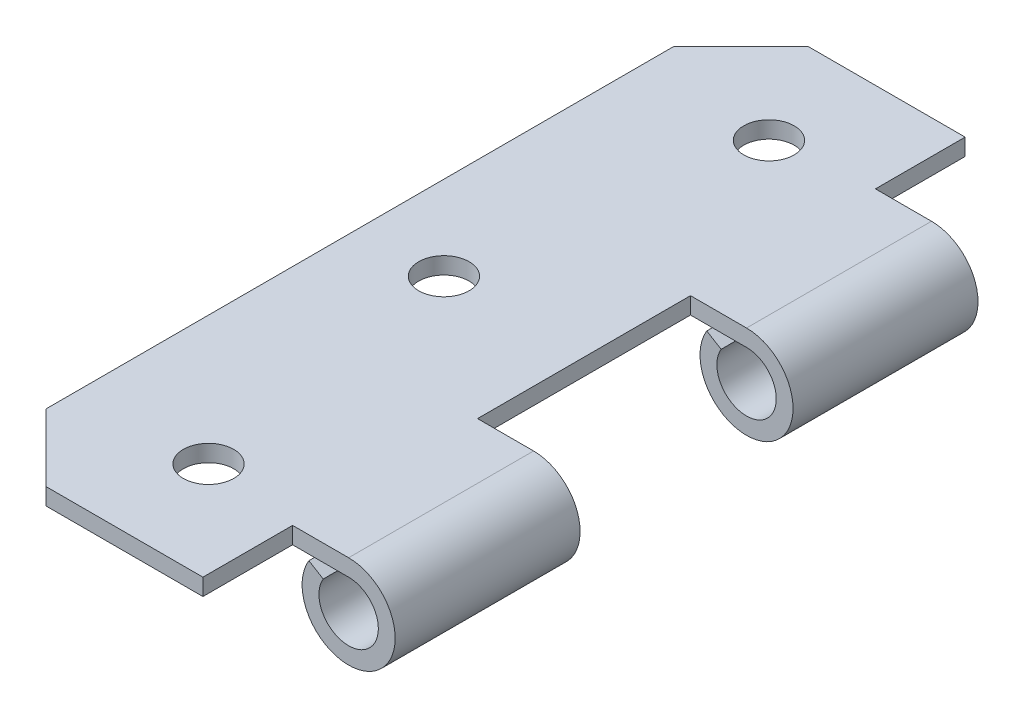
ISO-10303-21;
HEADER;
FILE_DESCRIPTION(('STEP AP214'),'2;1');
FILE_NAME('part.step','',(''),(''),'','','');
FILE_SCHEMA(('AUTOMOTIVE_DESIGN { 1 0 10303 214 1 1 1 1 }'));
ENDSEC;
DATA;
#1=APPLICATION_CONTEXT('core data for automotive mechanical design processes');
#2=APPLICATION_PROTOCOL_DEFINITION('international standard','automotive_design',2000,#1);
#3=PRODUCT_CONTEXT('',#1,'mechanical');
#4=PRODUCT('Part','Part','',(#3));
#5=PRODUCT_RELATED_PRODUCT_CATEGORY('part','',(#4));
#6=PRODUCT_DEFINITION_FORMATION('','',#4);
#7=PRODUCT_DEFINITION_CONTEXT('part definition',#1,'design');
#8=PRODUCT_DEFINITION('design','',#6,#7);
#9=PRODUCT_DEFINITION_SHAPE('','',#8);
#10=(LENGTH_UNIT() NAMED_UNIT(*) SI_UNIT(.MILLI.,.METRE.));
#11=(NAMED_UNIT(*) PLANE_ANGLE_UNIT() SI_UNIT($,.RADIAN.));
#12=(NAMED_UNIT(*) SI_UNIT($,.STERADIAN.) SOLID_ANGLE_UNIT());
#13=UNCERTAINTY_MEASURE_WITH_UNIT(LENGTH_MEASURE(1.E-05),#10,'distance_accuracy_value','');
#14=(GEOMETRIC_REPRESENTATION_CONTEXT(3) GLOBAL_UNCERTAINTY_ASSIGNED_CONTEXT((#13)) GLOBAL_UNIT_ASSIGNED_CONTEXT((#10,
#11,#12)) REPRESENTATION_CONTEXT('',''));
#15=CARTESIAN_POINT('',(0.,0.,0.));
#16=DIRECTION('',(0.,0.,1.));
#17=DIRECTION('',(1.,0.,0.));
#18=AXIS2_PLACEMENT_3D('',#15,#16,#17);
#19=CARTESIAN_POINT('',(12.5,-4.15,34.));
#20=DIRECTION('',(0.,0.,-1.));
#21=DIRECTION('',(-1.,0.,0.));
#22=AXIS2_PLACEMENT_3D('',#19,#20,#21);
#23=CYLINDRICAL_SURFACE('',#22,2.65);
#24=DIRECTION('',(0.,0.,-1.));
#25=VECTOR('',#24,1.);
#26=CARTESIAN_POINT('',(10.2333573843064,-2.77710843373494,34.));
#27=LINE('',#26,#25);
#28=CARTESIAN_POINT('',(10.2333573843064,-2.77710843373494,-9.5));
#29=VERTEX_POINT('',#28);
#30=CARTESIAN_POINT('',(10.2333573843064,-2.77710843373494,-26.));
#31=VERTEX_POINT('',#30);
#32=EDGE_CURVE('E281',#29,#31,#27,.T.);
#33=ORIENTED_EDGE('',*,*,#32,.F.);
#34=CARTESIAN_POINT('',(12.5,-4.15,-9.5));
#35=DIRECTION('',(0.,0.,-1.));
#36=DIRECTION('',(-1.,0.,0.));
#37=AXIS2_PLACEMENT_3D('',#34,#35,#36);
#38=CIRCLE('',#37,2.65);
#39=CARTESIAN_POINT('',(12.5,-1.5,-9.5));
#40=VERTEX_POINT('',#39);
#41=EDGE_CURVE('E227',#29,#40,#38,.F.);
#42=ORIENTED_EDGE('',*,*,#41,.T.);
#43=DIRECTION('',(0.,0.,-1.));
#44=VECTOR('',#43,1.);
#45=CARTESIAN_POINT('',(12.5,-1.5,34.));
#46=LINE('',#45,#44);
#47=CARTESIAN_POINT('',(12.5,-1.5,-26.));
#48=VERTEX_POINT('',#47);
#49=EDGE_CURVE('E266',#40,#48,#46,.T.);
#50=ORIENTED_EDGE('',*,*,#49,.T.);
#51=CARTESIAN_POINT('',(12.5,-4.15,-26.));
#52=DIRECTION('',(0.,0.,1.));
#53=DIRECTION('',(1.,0.,0.));
#54=AXIS2_PLACEMENT_3D('',#51,#52,#53);
#55=CIRCLE('',#54,2.65);
#56=EDGE_CURVE('E252',#48,#31,#55,.F.);
#57=ORIENTED_EDGE('',*,*,#56,.T.);
#58=EDGE_LOOP('',(#33,#42,#50,#57));
#59=FACE_BOUND('',#58,.T.);
#60=ADVANCED_FACE('F53',(#59),#23,.F.);
#61=CARTESIAN_POINT('',(8.95035213014023,-2.,34.));
#62=DIRECTION('',(0.518072289156626,0.855336836110788,0.));
#63=DIRECTION('',(-0.855336836110788,0.518072289156627,0.));
#64=AXIS2_PLACEMENT_3D('',#61,#62,#63);
#65=PLANE('',#64);
#66=DIRECTION('',(-0.855336836110788,0.518072289156627,0.));
#67=VECTOR('',#66,1.);
#68=CARTESIAN_POINT('',(8.95035213014023,-2.,-9.5));
#69=LINE('',#68,#67);
#70=CARTESIAN_POINT('',(8.95035213014023,-2.,-9.5));
#71=VERTEX_POINT('',#70);
#72=EDGE_CURVE('E230',#29,#71,#69,.T.);
#73=ORIENTED_EDGE('',*,*,#72,.F.);
#74=ORIENTED_EDGE('',*,*,#32,.T.);
#75=DIRECTION('',(0.855336836110788,-0.518072289156627,0.));
#76=VECTOR('',#75,1.);
#77=CARTESIAN_POINT('',(8.95035213014023,-2.,-26.));
#78=LINE('',#77,#76);
#79=CARTESIAN_POINT('',(8.95035213014023,-2.,-26.));
#80=VERTEX_POINT('',#79);
#81=EDGE_CURVE('E255',#80,#31,#78,.T.);
#82=ORIENTED_EDGE('',*,*,#81,.F.);
#83=DIRECTION('',(0.,0.,-1.));
#84=VECTOR('',#83,1.);
#85=CARTESIAN_POINT('',(8.95035213014023,-2.,34.));
#86=LINE('',#85,#84);
#87=EDGE_CURVE('E278',#71,#80,#86,.T.);
#88=ORIENTED_EDGE('',*,*,#87,.F.);
#89=EDGE_LOOP('',(#73,#74,#82,#88));
#90=FACE_BOUND('',#89,.T.);
#91=ADVANCED_FACE('F381',(#90),#65,.T.);
#92=CARTESIAN_POINT('',(12.5,-4.15,34.));
#93=DIRECTION('',(0.,0.,-1.));
#94=DIRECTION('',(-1.,0.,0.));
#95=AXIS2_PLACEMENT_3D('',#92,#93,#94);
#96=CYLINDRICAL_SURFACE('',#95,4.15);
#97=CARTESIAN_POINT('',(12.5,-4.15,-9.5));
#98=DIRECTION('',(0.,0.,-1.));
#99=DIRECTION('',(-1.,0.,0.));
#100=AXIS2_PLACEMENT_3D('',#97,#98,#99);
#101=CIRCLE('',#100,4.15);
#102=CARTESIAN_POINT('',(12.5,0.,-9.5));
#103=VERTEX_POINT('',#102);
#104=EDGE_CURVE('E233',#71,#103,#101,.F.);
#105=ORIENTED_EDGE('',*,*,#104,.F.);
#106=ORIENTED_EDGE('',*,*,#87,.T.);
#107=CARTESIAN_POINT('',(12.5,-4.15,-26.));
#108=DIRECTION('',(0.,0.,1.));
#109=DIRECTION('',(1.,0.,0.));
#110=AXIS2_PLACEMENT_3D('',#107,#108,#109);
#111=CIRCLE('',#110,4.15);
#112=CARTESIAN_POINT('',(12.5,0.,-26.));
#113=VERTEX_POINT('',#112);
#114=EDGE_CURVE('E258',#113,#80,#111,.F.);
#115=ORIENTED_EDGE('',*,*,#114,.F.);
#116=DIRECTION('',(0.,0.,-1.));
#117=VECTOR('',#116,1.);
#118=CARTESIAN_POINT('',(12.5,0.,34.));
#119=LINE('',#118,#117);
#120=EDGE_CURVE('E275',#103,#113,#119,.T.);
#121=ORIENTED_EDGE('',*,*,#120,.F.);
#122=EDGE_LOOP('',(#105,#106,#115,#121));
#123=FACE_BOUND('',#122,.T.);
#124=ADVANCED_FACE('F373',(#123),#96,.T.);
#125=CARTESIAN_POINT('',(10.2333573843064,-2.77710843373494,26.));
#126=VERTEX_POINT('',#125);
#127=CARTESIAN_POINT('',(10.2333573843064,-2.77710843373494,9.5));
#128=VERTEX_POINT('',#127);
#129=EDGE_CURVE('E283',#126,#128,#27,.T.);
#130=ORIENTED_EDGE('',*,*,#129,.F.);
#131=CARTESIAN_POINT('',(12.5,-4.15,26.));
#132=DIRECTION('',(0.,0.,-1.));
#133=DIRECTION('',(-1.,0.,0.));
#134=AXIS2_PLACEMENT_3D('',#131,#132,#133);
#135=CIRCLE('',#134,2.65);
#136=CARTESIAN_POINT('',(12.5,-1.5,26.));
#137=VERTEX_POINT('',#136);
#138=EDGE_CURVE('E235',#126,#137,#135,.F.);
#139=ORIENTED_EDGE('',*,*,#138,.T.);
#140=CARTESIAN_POINT('',(12.5,-1.5,9.5));
#141=VERTEX_POINT('',#140);
#142=EDGE_CURVE('E270',#137,#141,#46,.T.);
#143=ORIENTED_EDGE('',*,*,#142,.T.);
#144=CARTESIAN_POINT('',(12.5,-4.15,9.5));
#145=DIRECTION('',(0.,0.,1.));
#146=DIRECTION('',(1.,0.,0.));
#147=AXIS2_PLACEMENT_3D('',#144,#145,#146);
#148=CIRCLE('',#147,2.65);
#149=EDGE_CURVE('E220',#141,#128,#148,.F.);
#150=ORIENTED_EDGE('',*,*,#149,.T.);
#151=EDGE_LOOP('',(#130,#139,#143,#150));
#152=FACE_BOUND('',#151,.T.);
#153=ADVANCED_FACE('F348',(#152),#23,.F.);
#154=DIRECTION('',(-0.855336836110788,0.518072289156627,0.));
#155=VECTOR('',#154,1.);
#156=CARTESIAN_POINT('',(8.95035213014023,-2.,26.));
#157=LINE('',#156,#155);
#158=CARTESIAN_POINT('',(8.95035213014023,-2.,26.));
#159=VERTEX_POINT('',#158);
#160=EDGE_CURVE('E238',#126,#159,#157,.T.);
#161=ORIENTED_EDGE('',*,*,#160,.F.);
#162=ORIENTED_EDGE('',*,*,#129,.T.);
#163=DIRECTION('',(0.855336836110788,-0.518072289156627,0.));
#164=VECTOR('',#163,1.);
#165=CARTESIAN_POINT('',(8.95035213014023,-2.,9.5));
#166=LINE('',#165,#164);
#167=CARTESIAN_POINT('',(8.95035213014023,-2.,9.5));
#168=VERTEX_POINT('',#167);
#169=EDGE_CURVE('E223',#168,#128,#166,.T.);
#170=ORIENTED_EDGE('',*,*,#169,.F.);
#171=EDGE_CURVE('E280',#159,#168,#86,.T.);
#172=ORIENTED_EDGE('',*,*,#171,.F.);
#173=EDGE_LOOP('',(#161,#162,#170,#172));
#174=FACE_BOUND('',#173,.T.);
#175=ADVANCED_FACE('F352',(#174),#65,.T.);
#176=CARTESIAN_POINT('',(12.5,-4.15,26.));
#177=DIRECTION('',(0.,0.,-1.));
#178=DIRECTION('',(-1.,0.,0.));
#179=AXIS2_PLACEMENT_3D('',#176,#177,#178);
#180=CIRCLE('',#179,4.15);
#181=CARTESIAN_POINT('',(12.5,0.,26.));
#182=VERTEX_POINT('',#181);
#183=EDGE_CURVE('E195',#159,#182,#180,.F.);
#184=ORIENTED_EDGE('',*,*,#183,.F.);
#185=ORIENTED_EDGE('',*,*,#171,.T.);
#186=CARTESIAN_POINT('',(12.5,-4.15,9.5));
#187=DIRECTION('',(0.,0.,1.));
#188=DIRECTION('',(1.,0.,0.));
#189=AXIS2_PLACEMENT_3D('',#186,#187,#188);
#190=CIRCLE('',#189,4.15);
#191=CARTESIAN_POINT('',(12.5,0.,9.5));
#192=VERTEX_POINT('',#191);
#193=EDGE_CURVE('E225',#192,#168,#190,.F.);
#194=ORIENTED_EDGE('',*,*,#193,.F.);
#195=EDGE_CURVE('E277',#182,#192,#119,.T.);
#196=ORIENTED_EDGE('',*,*,#195,.F.);
#197=EDGE_LOOP('',(#184,#185,#194,#196));
#198=FACE_BOUND('',#197,.T.);
#199=ADVANCED_FACE('F357',(#198),#96,.T.);
#200=CARTESIAN_POINT('',(-12.5,0.,34.));
#201=DIRECTION('',(0.,1.,0.));
#202=DIRECTION('',(-1.,0.,0.));
#203=AXIS2_PLACEMENT_3D('',#200,#201,#202);
#204=PLANE('',#203);
#205=CARTESIAN_POINT('',(-0.999999999999995,0.,25.));
#206=DIRECTION('',(0.,1.,0.));
#207=DIRECTION('',(-1.,0.,0.));
#208=AXIS2_PLACEMENT_3D('',#205,#206,#207);
#209=CIRCLE('',#208,2.25);
#210=CARTESIAN_POINT('',(-3.24999999999999,0.,25.));
#211=VERTEX_POINT('',#210);
#212=EDGE_CURVE('E311',#211,#211,#209,.T.);
#213=ORIENTED_EDGE('',*,*,#212,.F.);
#214=EDGE_LOOP('',(#213));
#215=FACE_BOUND('',#214,.T.);
#216=CARTESIAN_POINT('',(-5.,0.,0.));
#217=DIRECTION('',(0.,1.,0.));
#218=DIRECTION('',(-1.,0.,0.));
#219=AXIS2_PLACEMENT_3D('',#216,#217,#218);
#220=CIRCLE('',#219,2.25);
#221=CARTESIAN_POINT('',(-7.25,0.,0.));
#222=VERTEX_POINT('',#221);
#223=EDGE_CURVE('E606',#222,#222,#220,.T.);
#224=ORIENTED_EDGE('',*,*,#223,.F.);
#225=EDGE_LOOP('',(#224));
#226=FACE_BOUND('',#225,.T.);
#227=CARTESIAN_POINT('',(-1.,0.,-25.));
#228=DIRECTION('',(0.,1.,0.));
#229=DIRECTION('',(-1.,0.,0.));
#230=AXIS2_PLACEMENT_3D('',#227,#228,#229);
#231=CIRCLE('',#230,2.25);
#232=CARTESIAN_POINT('',(-3.25,0.,-25.));
#233=VERTEX_POINT('',#232);
#234=EDGE_CURVE('E306',#233,#233,#231,.T.);
#235=ORIENTED_EDGE('',*,*,#234,.F.);
#236=EDGE_LOOP('',(#235));
#237=FACE_BOUND('',#236,.T.);
#238=DIRECTION('',(1.,0.,0.));
#239=VECTOR('',#238,1.);
#240=CARTESIAN_POINT('',(-12.5,0.,-34.));
#241=LINE('',#240,#239);
#242=CARTESIAN_POINT('',(-6.5,0.,-34.));
#243=VERTEX_POINT('',#242);
#244=CARTESIAN_POINT('',(7.50000000000001,0.,-34.));
#245=VERTEX_POINT('',#244);
#246=EDGE_CURVE('E261',#243,#245,#241,.T.);
#247=ORIENTED_EDGE('',*,*,#246,.F.);
#248=DIRECTION('',(-0.707106781186548,0.,0.707106781186548));
#249=VECTOR('',#248,1.);
#250=CARTESIAN_POINT('',(-43.5,0.,3.));
#251=LINE('',#250,#249);
#252=CARTESIAN_POINT('',(-12.5,0.,-28.));
#253=VERTEX_POINT('',#252);
#254=EDGE_CURVE('E318',#243,#253,#251,.T.);
#255=ORIENTED_EDGE('',*,*,#254,.T.);
#256=DIRECTION('',(0.,0.,-1.));
#257=VECTOR('',#256,1.);
#258=CARTESIAN_POINT('',(-12.5,0.,34.));
#259=LINE('',#258,#257);
#260=CARTESIAN_POINT('',(-12.5,0.,28.));
#261=VERTEX_POINT('',#260);
#262=EDGE_CURVE('E273',#261,#253,#259,.T.);
#263=ORIENTED_EDGE('',*,*,#262,.F.);
#264=DIRECTION('',(-0.707106781186548,0.,-0.707106781186548));
#265=VECTOR('',#264,1.);
#266=CARTESIAN_POINT('',(-9.5,0.,31.));
#267=LINE('',#266,#265);
#268=CARTESIAN_POINT('',(-6.5,0.,34.));
#269=VERTEX_POINT('',#268);
#270=EDGE_CURVE('E316',#261,#269,#267,.F.);
#271=ORIENTED_EDGE('',*,*,#270,.T.);
#272=DIRECTION('',(1.,0.,0.));
#273=VECTOR('',#272,1.);
#274=CARTESIAN_POINT('',(-12.5,0.,34.));
#275=LINE('',#274,#273);
#276=CARTESIAN_POINT('',(7.5,0.,34.));
#277=VERTEX_POINT('',#276);
#278=EDGE_CURVE('E203',#269,#277,#275,.T.);
#279=ORIENTED_EDGE('',*,*,#278,.T.);
#280=DIRECTION('',(0.,0.,1.));
#281=VECTOR('',#280,1.);
#282=CARTESIAN_POINT('',(7.50000000000001,0.,34.));
#283=LINE('',#282,#281);
#284=CARTESIAN_POINT('',(7.50000000000001,0.,26.));
#285=VERTEX_POINT('',#284);
#286=EDGE_CURVE('E184',#285,#277,#283,.T.);
#287=ORIENTED_EDGE('',*,*,#286,.F.);
#288=DIRECTION('',(-1.,0.,0.));
#289=VECTOR('',#288,1.);
#290=CARTESIAN_POINT('',(16.65,0.,26.));
#291=LINE('',#290,#289);
#292=EDGE_CURVE('E192',#182,#285,#291,.T.);
#293=ORIENTED_EDGE('',*,*,#292,.F.);
#294=ORIENTED_EDGE('',*,*,#195,.T.);
#295=DIRECTION('',(1.,0.,0.));
#296=VECTOR('',#295,1.);
#297=CARTESIAN_POINT('',(7.5,0.,9.5));
#298=LINE('',#297,#296);
#299=CARTESIAN_POINT('',(7.5,0.,9.5));
#300=VERTEX_POINT('',#299);
#301=EDGE_CURVE('E210',#300,#192,#298,.T.);
#302=ORIENTED_EDGE('',*,*,#301,.F.);
#303=DIRECTION('',(0.,0.,1.));
#304=VECTOR('',#303,1.);
#305=CARTESIAN_POINT('',(7.5,0.,-9.5));
#306=LINE('',#305,#304);
#307=CARTESIAN_POINT('',(7.5,0.,-9.5));
#308=VERTEX_POINT('',#307);
#309=EDGE_CURVE('E207',#308,#300,#306,.T.);
#310=ORIENTED_EDGE('',*,*,#309,.F.);
#311=DIRECTION('',(-1.,0.,0.));
#312=VECTOR('',#311,1.);
#313=CARTESIAN_POINT('',(7.5,0.,-9.5));
#314=LINE('',#313,#312);
#315=EDGE_CURVE('E213',#103,#308,#314,.T.);
#316=ORIENTED_EDGE('',*,*,#315,.F.);
#317=ORIENTED_EDGE('',*,*,#120,.T.);
#318=DIRECTION('',(1.,0.,0.));
#319=VECTOR('',#318,1.);
#320=CARTESIAN_POINT('',(16.65,0.,-26.));
#321=LINE('',#320,#319);
#322=CARTESIAN_POINT('',(7.50000000000001,0.,-26.));
#323=VERTEX_POINT('',#322);
#324=EDGE_CURVE('E244',#323,#113,#321,.T.);
#325=ORIENTED_EDGE('',*,*,#324,.F.);
#326=DIRECTION('',(0.,0.,1.));
#327=VECTOR('',#326,1.);
#328=CARTESIAN_POINT('',(7.50000000000001,0.,-34.));
#329=LINE('',#328,#327);
#330=EDGE_CURVE('E241',#245,#323,#329,.T.);
#331=ORIENTED_EDGE('',*,*,#330,.F.);
#332=EDGE_LOOP('',(#247,#255,#263,#271,#279,#287,#293,#294,#302,#310,#316,#317,#325,#331));
#333=FACE_BOUND('',#332,.T.);
#334=ADVANCED_FACE('F202',(#215,#226,#237,#333),#204,.T.);
#335=CARTESIAN_POINT('',(-12.5,-1.5,34.));
#336=DIRECTION('',(-1.,0.,0.));
#337=DIRECTION('',(0.,0.,1.));
#338=AXIS2_PLACEMENT_3D('',#335,#336,#337);
#339=PLANE('',#338);
#340=ORIENTED_EDGE('',*,*,#262,.T.);
#341=DIRECTION('',(0.,-1.,0.));
#342=VECTOR('',#341,1.);
#343=CARTESIAN_POINT('',(-12.5,-1.5,-28.));
#344=LINE('',#343,#342);
#345=CARTESIAN_POINT('',(-12.5,-1.5,-28.));
#346=VERTEX_POINT('',#345);
#347=EDGE_CURVE('E74',#253,#346,#344,.T.);
#348=ORIENTED_EDGE('',*,*,#347,.T.);
#349=DIRECTION('',(0.,0.,-1.));
#350=VECTOR('',#349,1.);
#351=CARTESIAN_POINT('',(-12.5,-1.5,34.));
#352=LINE('',#351,#350);
#353=CARTESIAN_POINT('',(-12.5,-1.5,28.));
#354=VERTEX_POINT('',#353);
#355=EDGE_CURVE('E271',#354,#346,#352,.T.);
#356=ORIENTED_EDGE('',*,*,#355,.F.);
#357=DIRECTION('',(0.,1.,0.));
#358=VECTOR('',#357,1.);
#359=CARTESIAN_POINT('',(-12.5,-1.5,28.));
#360=LINE('',#359,#358);
#361=EDGE_CURVE('E320',#354,#261,#360,.T.);
#362=ORIENTED_EDGE('',*,*,#361,.T.);
#363=EDGE_LOOP('',(#340,#348,#356,#362));
#364=FACE_BOUND('',#363,.T.);
#365=ADVANCED_FACE('F338',(#364),#339,.T.);
#366=CARTESIAN_POINT('',(-12.5,-1.5,34.));
#367=DIRECTION('',(0.,1.,0.));
#368=DIRECTION('',(-1.,0.,0.));
#369=AXIS2_PLACEMENT_3D('',#366,#367,#368);
#370=PLANE('',#369);
#371=CARTESIAN_POINT('',(-0.999999999999995,-1.5,25.));
#372=DIRECTION('',(0.,1.,0.));
#373=DIRECTION('',(-1.,0.,0.));
#374=AXIS2_PLACEMENT_3D('',#371,#372,#373);
#375=CIRCLE('',#374,2.25);
#376=CARTESIAN_POINT('',(-3.24999999999999,-1.5,25.));
#377=VERTEX_POINT('',#376);
#378=EDGE_CURVE('E310',#377,#377,#375,.T.);
#379=ORIENTED_EDGE('',*,*,#378,.T.);
#380=EDGE_LOOP('',(#379));
#381=FACE_BOUND('',#380,.T.);
#382=CARTESIAN_POINT('',(-5.,-1.5,0.));
#383=DIRECTION('',(0.,1.,0.));
#384=DIRECTION('',(-1.,0.,0.));
#385=AXIS2_PLACEMENT_3D('',#382,#383,#384);
#386=CIRCLE('',#385,2.25);
#387=CARTESIAN_POINT('',(-7.25,-1.5,0.));
#388=VERTEX_POINT('',#387);
#389=EDGE_CURVE('E307',#388,#388,#386,.T.);
#390=ORIENTED_EDGE('',*,*,#389,.T.);
#391=EDGE_LOOP('',(#390));
#392=FACE_BOUND('',#391,.T.);
#393=CARTESIAN_POINT('',(-1.,-1.5,-25.));
#394=DIRECTION('',(0.,1.,0.));
#395=DIRECTION('',(-1.,0.,0.));
#396=AXIS2_PLACEMENT_3D('',#393,#394,#395);
#397=CIRCLE('',#396,2.25);
#398=CARTESIAN_POINT('',(-3.25,-1.5,-25.));
#399=VERTEX_POINT('',#398);
#400=EDGE_CURVE('E211',#399,#399,#397,.T.);
#401=ORIENTED_EDGE('',*,*,#400,.T.);
#402=EDGE_LOOP('',(#401));
#403=FACE_BOUND('',#402,.T.);
#404=ORIENTED_EDGE('',*,*,#355,.T.);
#405=DIRECTION('',(0.707106781186548,0.,-0.707106781186548));
#406=VECTOR('',#405,1.);
#407=CARTESIAN_POINT('',(-6.5,-1.5,-34.));
#408=LINE('',#407,#406);
#409=CARTESIAN_POINT('',(-6.5,-1.5,-34.));
#410=VERTEX_POINT('',#409);
#411=EDGE_CURVE('E61',#346,#410,#408,.T.);
#412=ORIENTED_EDGE('',*,*,#411,.T.);
#413=DIRECTION('',(1.,0.,0.));
#414=VECTOR('',#413,1.);
#415=CARTESIAN_POINT('',(-12.5,-1.5,-34.));
#416=LINE('',#415,#414);
#417=CARTESIAN_POINT('',(7.50000000000001,-1.5,-34.));
#418=VERTEX_POINT('',#417);
#419=EDGE_CURVE('E264',#410,#418,#416,.T.);
#420=ORIENTED_EDGE('',*,*,#419,.T.);
#421=DIRECTION('',(0.,0.,1.));
#422=VECTOR('',#421,1.);
#423=CARTESIAN_POINT('',(7.49999999999999,-1.5,34.));
#424=LINE('',#423,#422);
#425=CARTESIAN_POINT('',(7.50000000000001,-1.5,-26.));
#426=VERTEX_POINT('',#425);
#427=EDGE_CURVE('E249',#418,#426,#424,.T.);
#428=ORIENTED_EDGE('',*,*,#427,.T.);
#429=DIRECTION('',(1.,0.,0.));
#430=VECTOR('',#429,1.);
#431=CARTESIAN_POINT('',(-12.5,-1.5,-26.));
#432=LINE('',#431,#430);
#433=EDGE_CURVE('E287',#426,#48,#432,.T.);
#434=ORIENTED_EDGE('',*,*,#433,.T.);
#435=ORIENTED_EDGE('',*,*,#49,.F.);
#436=DIRECTION('',(-1.,0.,0.));
#437=VECTOR('',#436,1.);
#438=CARTESIAN_POINT('',(-12.5,-1.5,-9.5));
#439=LINE('',#438,#437);
#440=CARTESIAN_POINT('',(7.5,-1.5,-9.5));
#441=VERTEX_POINT('',#440);
#442=EDGE_CURVE('E298',#40,#441,#439,.T.);
#443=ORIENTED_EDGE('',*,*,#442,.T.);
#444=DIRECTION('',(0.,0.,1.));
#445=VECTOR('',#444,1.);
#446=CARTESIAN_POINT('',(7.5,-1.5,34.));
#447=LINE('',#446,#445);
#448=CARTESIAN_POINT('',(7.5,-1.5,9.5));
#449=VERTEX_POINT('',#448);
#450=EDGE_CURVE('E295',#441,#449,#447,.T.);
#451=ORIENTED_EDGE('',*,*,#450,.T.);
#452=DIRECTION('',(1.,0.,0.));
#453=VECTOR('',#452,1.);
#454=CARTESIAN_POINT('',(-12.5,-1.5,9.5));
#455=LINE('',#454,#453);
#456=EDGE_CURVE('E292',#449,#141,#455,.T.);
#457=ORIENTED_EDGE('',*,*,#456,.T.);
#458=ORIENTED_EDGE('',*,*,#142,.F.);
#459=DIRECTION('',(-1.,0.,0.));
#460=VECTOR('',#459,1.);
#461=CARTESIAN_POINT('',(-12.5,-1.5,26.));
#462=LINE('',#461,#460);
#463=CARTESIAN_POINT('',(7.50000000000001,-1.5,26.));
#464=VERTEX_POINT('',#463);
#465=EDGE_CURVE('E301',#137,#464,#462,.T.);
#466=ORIENTED_EDGE('',*,*,#465,.T.);
#467=DIRECTION('',(0.,0.,1.));
#468=VECTOR('',#467,1.);
#469=CARTESIAN_POINT('',(7.50000000000001,-1.5,34.));
#470=LINE('',#469,#468);
#471=CARTESIAN_POINT('',(7.50000000000001,-1.5,34.));
#472=VERTEX_POINT('',#471);
#473=EDGE_CURVE('E187',#464,#472,#470,.T.);
#474=ORIENTED_EDGE('',*,*,#473,.T.);
#475=DIRECTION('',(1.,0.,0.));
#476=VECTOR('',#475,1.);
#477=CARTESIAN_POINT('',(-12.5,-1.5,34.));
#478=LINE('',#477,#476);
#479=CARTESIAN_POINT('',(-6.5,-1.5,34.));
#480=VERTEX_POINT('',#479);
#481=EDGE_CURVE('E263',#480,#472,#478,.T.);
#482=ORIENTED_EDGE('',*,*,#481,.F.);
#483=DIRECTION('',(0.707106781186548,0.,0.707106781186548));
#484=VECTOR('',#483,1.);
#485=CARTESIAN_POINT('',(-12.5,-1.5,28.));
#486=LINE('',#485,#484);
#487=EDGE_CURVE('E324',#480,#354,#486,.F.);
#488=ORIENTED_EDGE('',*,*,#487,.T.);
#489=EDGE_LOOP('',(#404,#412,#420,#428,#434,#435,#443,#451,#457,#458,#466,#474,#482,#488));
#490=FACE_BOUND('',#489,.T.);
#491=ADVANCED_FACE('F328',(#381,#392,#403,#490),#370,.F.);
#492=CARTESIAN_POINT('',(12.5,-4.15,34.));
#493=DIRECTION('',(0.,0.,1.));
#494=DIRECTION('',(1.,0.,0.));
#495=AXIS2_PLACEMENT_3D('',#492,#493,#494);
#496=PLANE('',#495);
#497=ORIENTED_EDGE('',*,*,#278,.F.);
#498=DIRECTION('',(0.,-1.,0.));
#499=VECTOR('',#498,1.);
#500=CARTESIAN_POINT('',(-6.5,-4.15,34.));
#501=LINE('',#500,#499);
#502=EDGE_CURVE('E14',#269,#480,#501,.T.);
#503=ORIENTED_EDGE('',*,*,#502,.T.);
#504=ORIENTED_EDGE('',*,*,#481,.T.);
#505=DIRECTION('',(0.,-1.,0.));
#506=VECTOR('',#505,1.);
#507=CARTESIAN_POINT('',(7.50000000000001,-4.15,34.));
#508=LINE('',#507,#506);
#509=EDGE_CURVE('E290',#277,#472,#508,.T.);
#510=ORIENTED_EDGE('',*,*,#509,.F.);
#511=EDGE_LOOP('',(#497,#503,#504,#510));
#512=FACE_BOUND('',#511,.T.);
#513=ADVANCED_FACE('F342',(#512),#496,.T.);
#514=CARTESIAN_POINT('',(12.5,-4.15,-34.));
#515=DIRECTION('',(0.,0.,1.));
#516=DIRECTION('',(1.,0.,0.));
#517=AXIS2_PLACEMENT_3D('',#514,#515,#516);
#518=PLANE('',#517);
#519=ORIENTED_EDGE('',*,*,#419,.F.);
#520=DIRECTION('',(0.,1.,0.));
#521=VECTOR('',#520,1.);
#522=CARTESIAN_POINT('',(-6.5,0.,-34.));
#523=LINE('',#522,#521);
#524=EDGE_CURVE('E303',#410,#243,#523,.T.);
#525=ORIENTED_EDGE('',*,*,#524,.T.);
#526=ORIENTED_EDGE('',*,*,#246,.T.);
#527=DIRECTION('',(0.,-1.,0.));
#528=VECTOR('',#527,1.);
#529=CARTESIAN_POINT('',(7.50000000000001,-4.15,-34.));
#530=LINE('',#529,#528);
#531=EDGE_CURVE('E284',#245,#418,#530,.T.);
#532=ORIENTED_EDGE('',*,*,#531,.T.);
#533=EDGE_LOOP('',(#519,#525,#526,#532));
#534=FACE_BOUND('',#533,.T.);
#535=ADVANCED_FACE('F333',(#534),#518,.F.);
#536=CARTESIAN_POINT('',(7.50000000000001,-8.3,-34.));
#537=DIRECTION('',(-1.,0.,0.));
#538=DIRECTION('',(0.,0.,1.));
#539=AXIS2_PLACEMENT_3D('',#536,#537,#538);
#540=PLANE('',#539);
#541=ORIENTED_EDGE('',*,*,#531,.F.);
#542=ORIENTED_EDGE('',*,*,#330,.T.);
#543=DIRECTION('',(0.,1.,0.));
#544=VECTOR('',#543,1.);
#545=CARTESIAN_POINT('',(7.50000000000001,-8.3,-26.));
#546=LINE('',#545,#544);
#547=EDGE_CURVE('E247',#426,#323,#546,.T.);
#548=ORIENTED_EDGE('',*,*,#547,.F.);
#549=ORIENTED_EDGE('',*,*,#427,.F.);
#550=EDGE_LOOP('',(#541,#542,#548,#549));
#551=FACE_BOUND('',#550,.T.);
#552=ADVANCED_FACE('F387',(#551),#540,.F.);
#553=CARTESIAN_POINT('',(16.65,-8.3,-26.));
#554=DIRECTION('',(0.,0.,1.));
#555=DIRECTION('',(1.,0.,0.));
#556=AXIS2_PLACEMENT_3D('',#553,#554,#555);
#557=PLANE('',#556);
#558=ORIENTED_EDGE('',*,*,#114,.T.);
#559=ORIENTED_EDGE('',*,*,#81,.T.);
#560=ORIENTED_EDGE('',*,*,#56,.F.);
#561=ORIENTED_EDGE('',*,*,#433,.F.);
#562=ORIENTED_EDGE('',*,*,#547,.T.);
#563=ORIENTED_EDGE('',*,*,#324,.T.);
#564=EDGE_LOOP('',(#558,#559,#560,#561,#562,#563));
#565=FACE_BOUND('',#564,.T.);
#566=ADVANCED_FACE('F377',(#565),#557,.F.);
#567=CARTESIAN_POINT('',(7.50000000000001,-8.3,34.));
#568=DIRECTION('',(-1.,0.,0.));
#569=DIRECTION('',(0.,0.,1.));
#570=AXIS2_PLACEMENT_3D('',#567,#568,#569);
#571=PLANE('',#570);
#572=DIRECTION('',(0.,1.,0.));
#573=VECTOR('',#572,1.);
#574=CARTESIAN_POINT('',(7.50000000000001,-8.3,26.));
#575=LINE('',#574,#573);
#576=EDGE_CURVE('E179',#464,#285,#575,.T.);
#577=ORIENTED_EDGE('',*,*,#576,.T.);
#578=ORIENTED_EDGE('',*,*,#286,.T.);
#579=ORIENTED_EDGE('',*,*,#509,.T.);
#580=ORIENTED_EDGE('',*,*,#473,.F.);
#581=EDGE_LOOP('',(#577,#578,#579,#580));
#582=FACE_BOUND('',#581,.T.);
#583=ADVANCED_FACE('F181',(#582),#571,.F.);
#584=CARTESIAN_POINT('',(16.65,-8.3,26.));
#585=DIRECTION('',(0.,0.,-1.));
#586=DIRECTION('',(-1.,0.,0.));
#587=AXIS2_PLACEMENT_3D('',#584,#585,#586);
#588=PLANE('',#587);
#589=ORIENTED_EDGE('',*,*,#183,.T.);
#590=ORIENTED_EDGE('',*,*,#292,.T.);
#591=ORIENTED_EDGE('',*,*,#576,.F.);
#592=ORIENTED_EDGE('',*,*,#465,.F.);
#593=ORIENTED_EDGE('',*,*,#138,.F.);
#594=ORIENTED_EDGE('',*,*,#160,.T.);
#595=EDGE_LOOP('',(#589,#590,#591,#592,#593,#594));
#596=FACE_BOUND('',#595,.T.);
#597=ADVANCED_FACE('F193',(#596),#588,.F.);
#598=CARTESIAN_POINT('',(7.5,-8.3,-9.5));
#599=DIRECTION('',(-1.,0.,0.));
#600=DIRECTION('',(0.,-1.,0.));
#601=AXIS2_PLACEMENT_3D('',#598,#599,#600);
#602=PLANE('',#601);
#603=DIRECTION('',(0.,1.,0.));
#604=VECTOR('',#603,1.);
#605=CARTESIAN_POINT('',(7.5,-8.3,-9.5));
#606=LINE('',#605,#604);
#607=EDGE_CURVE('E199',#441,#308,#606,.T.);
#608=ORIENTED_EDGE('',*,*,#607,.T.);
#609=ORIENTED_EDGE('',*,*,#309,.T.);
#610=DIRECTION('',(0.,1.,0.));
#611=VECTOR('',#610,1.);
#612=CARTESIAN_POINT('',(7.5,-8.3,9.5));
#613=LINE('',#612,#611);
#614=EDGE_CURVE('E216',#449,#300,#613,.T.);
#615=ORIENTED_EDGE('',*,*,#614,.F.);
#616=ORIENTED_EDGE('',*,*,#450,.F.);
#617=EDGE_LOOP('',(#608,#609,#615,#616));
#618=FACE_BOUND('',#617,.T.);
#619=ADVANCED_FACE('F365',(#618),#602,.F.);
#620=CARTESIAN_POINT('',(7.5,-8.3,-9.5));
#621=DIRECTION('',(0.,0.,-1.));
#622=DIRECTION('',(-1.,0.,0.));
#623=AXIS2_PLACEMENT_3D('',#620,#621,#622);
#624=PLANE('',#623);
#625=ORIENTED_EDGE('',*,*,#104,.T.);
#626=ORIENTED_EDGE('',*,*,#315,.T.);
#627=ORIENTED_EDGE('',*,*,#607,.F.);
#628=ORIENTED_EDGE('',*,*,#442,.F.);
#629=ORIENTED_EDGE('',*,*,#41,.F.);
#630=ORIENTED_EDGE('',*,*,#72,.T.);
#631=EDGE_LOOP('',(#625,#626,#627,#628,#629,#630));
#632=FACE_BOUND('',#631,.T.);
#633=ADVANCED_FACE('F368',(#632),#624,.F.);
#634=CARTESIAN_POINT('',(7.5,-8.3,9.5));
#635=DIRECTION('',(0.,0.,1.));
#636=DIRECTION('',(1.,0.,0.));
#637=AXIS2_PLACEMENT_3D('',#634,#635,#636);
#638=PLANE('',#637);
#639=ORIENTED_EDGE('',*,*,#193,.T.);
#640=ORIENTED_EDGE('',*,*,#169,.T.);
#641=ORIENTED_EDGE('',*,*,#149,.F.);
#642=ORIENTED_EDGE('',*,*,#456,.F.);
#643=ORIENTED_EDGE('',*,*,#614,.T.);
#644=ORIENTED_EDGE('',*,*,#301,.T.);
#645=EDGE_LOOP('',(#639,#640,#641,#642,#643,#644));
#646=FACE_BOUND('',#645,.T.);
#647=ADVANCED_FACE('F362',(#646),#638,.F.);
#648=CARTESIAN_POINT('',(-1.,-10.,-25.));
#649=DIRECTION('',(0.,1.,0.));
#650=DIRECTION('',(-1.,0.,0.));
#651=AXIS2_PLACEMENT_3D('',#648,#649,#650);
#652=CYLINDRICAL_SURFACE('',#651,2.25);
#653=ORIENTED_EDGE('',*,*,#234,.T.);
#654=EDGE_LOOP('',(#653));
#655=FACE_BOUND('',#654,.T.);
#656=ORIENTED_EDGE('',*,*,#400,.F.);
#657=EDGE_LOOP('',(#656));
#658=FACE_BOUND('',#657,.T.);
#659=ADVANCED_FACE('F468',(#655,#658),#652,.F.);
#660=CARTESIAN_POINT('',(-5.,-10.,0.));
#661=DIRECTION('',(0.,1.,0.));
#662=DIRECTION('',(-1.,0.,0.));
#663=AXIS2_PLACEMENT_3D('',#660,#661,#662);
#664=CYLINDRICAL_SURFACE('',#663,2.25);
#665=ORIENTED_EDGE('',*,*,#223,.T.);
#666=EDGE_LOOP('',(#665));
#667=FACE_BOUND('',#666,.T.);
#668=ORIENTED_EDGE('',*,*,#389,.F.);
#669=EDGE_LOOP('',(#668));
#670=FACE_BOUND('',#669,.T.);
#671=ADVANCED_FACE('F461',(#667,#670),#664,.F.);
#672=CARTESIAN_POINT('',(-0.999999999999995,-10.,25.));
#673=DIRECTION('',(0.,1.,0.));
#674=DIRECTION('',(-1.,0.,0.));
#675=AXIS2_PLACEMENT_3D('',#672,#673,#674);
#676=CYLINDRICAL_SURFACE('',#675,2.25);
#677=ORIENTED_EDGE('',*,*,#212,.T.);
#678=EDGE_LOOP('',(#677));
#679=FACE_BOUND('',#678,.T.);
#680=ORIENTED_EDGE('',*,*,#378,.F.);
#681=EDGE_LOOP('',(#680));
#682=FACE_BOUND('',#681,.T.);
#683=ADVANCED_FACE('F446',(#679,#682),#676,.F.);
#684=CARTESIAN_POINT('',(-6.5,-4.15,-34.));
#685=DIRECTION('',(-0.707106781186548,0.,-0.707106781186548));
#686=DIRECTION('',(0.,-1.,0.));
#687=AXIS2_PLACEMENT_3D('',#684,#685,#686);
#688=PLANE('',#687);
#689=ORIENTED_EDGE('',*,*,#411,.F.);
#690=ORIENTED_EDGE('',*,*,#347,.F.);
#691=ORIENTED_EDGE('',*,*,#254,.F.);
#692=ORIENTED_EDGE('',*,*,#524,.F.);
#693=EDGE_LOOP('',(#689,#690,#691,#692));
#694=FACE_BOUND('',#693,.T.);
#695=ADVANCED_FACE('F335',(#694),#688,.T.);
#696=CARTESIAN_POINT('',(-12.5,-1.5,28.));
#697=DIRECTION('',(0.707106781186548,0.,-0.707106781186548));
#698=DIRECTION('',(0.,1.,0.));
#699=AXIS2_PLACEMENT_3D('',#696,#697,#698);
#700=PLANE('',#699);
#701=ORIENTED_EDGE('',*,*,#487,.F.);
#702=ORIENTED_EDGE('',*,*,#502,.F.);
#703=ORIENTED_EDGE('',*,*,#270,.F.);
#704=ORIENTED_EDGE('',*,*,#361,.F.);
#705=EDGE_LOOP('',(#701,#702,#703,#704));
#706=FACE_BOUND('',#705,.T.);
#707=ADVANCED_FACE('F55',(#706),#700,.F.);
#708=CLOSED_SHELL('',(#60,#91,#124,#153,#175,#199,#334,#365,#491,#513,#535,#552,#566,#583,#597,
#619,#633,#647,#659,#671,#683,#695,#707));
#709=MANIFOLD_SOLID_BREP('B2',#708);
#710=ADVANCED_BREP_SHAPE_REPRESENTATION('',(#18,#709),#14);
#711=SHAPE_DEFINITION_REPRESENTATION(#9,#710);
ENDSEC;
END-ISO-10303-21;
